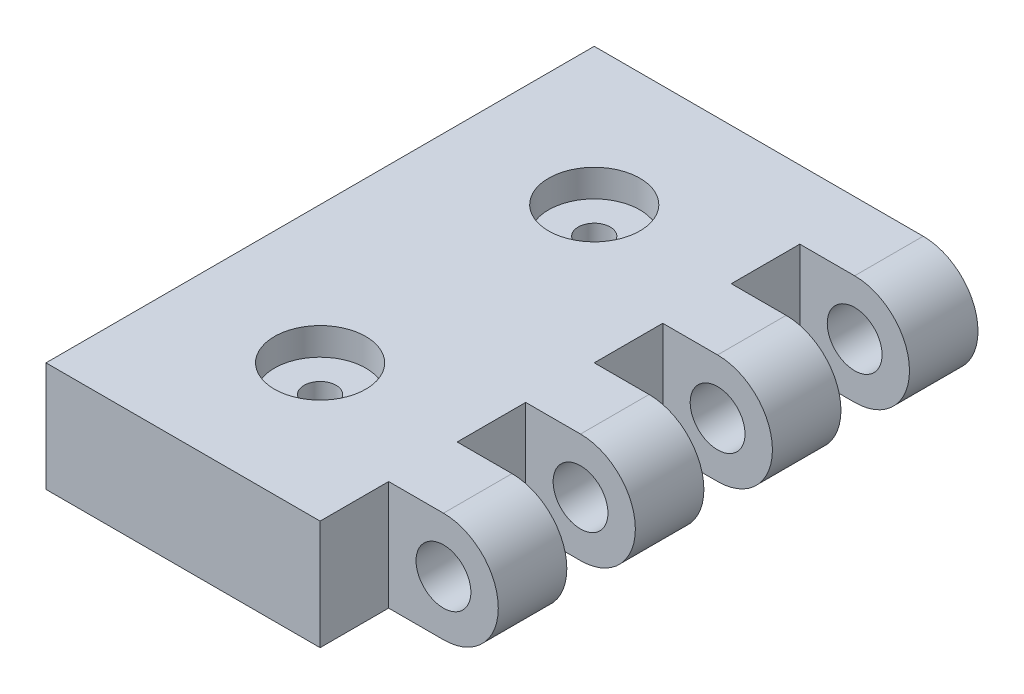
ISO-10303-21;
HEADER;
FILE_DESCRIPTION(('STEP AP214'),'2;1');
FILE_NAME('part.step','',(''),(''),'','','');
FILE_SCHEMA(('AUTOMOTIVE_DESIGN { 1 0 10303 214 1 1 1 1 }'));
ENDSEC;
DATA;
#1=APPLICATION_CONTEXT('core data for automotive mechanical design processes');
#2=APPLICATION_PROTOCOL_DEFINITION('international standard','automotive_design',2000,#1);
#3=PRODUCT_CONTEXT('',#1,'mechanical');
#4=PRODUCT('Part','Part','',(#3));
#5=PRODUCT_RELATED_PRODUCT_CATEGORY('part','',(#4));
#6=PRODUCT_DEFINITION_FORMATION('','',#4);
#7=PRODUCT_DEFINITION_CONTEXT('part definition',#1,'design');
#8=PRODUCT_DEFINITION('design','',#6,#7);
#9=PRODUCT_DEFINITION_SHAPE('','',#8);
#10=(LENGTH_UNIT() NAMED_UNIT(*) SI_UNIT(.MILLI.,.METRE.));
#11=(NAMED_UNIT(*) PLANE_ANGLE_UNIT() SI_UNIT($,.RADIAN.));
#12=(NAMED_UNIT(*) SI_UNIT($,.STERADIAN.) SOLID_ANGLE_UNIT());
#13=UNCERTAINTY_MEASURE_WITH_UNIT(LENGTH_MEASURE(1.E-05),#10,'distance_accuracy_value','');
#14=(GEOMETRIC_REPRESENTATION_CONTEXT(3) GLOBAL_UNCERTAINTY_ASSIGNED_CONTEXT((#13)) GLOBAL_UNIT_ASSIGNED_CONTEXT((#10,
#11,#12)) REPRESENTATION_CONTEXT('',''));
#15=CARTESIAN_POINT('',(0.,0.,0.));
#16=DIRECTION('',(0.,0.,1.));
#17=DIRECTION('',(1.,0.,0.));
#18=AXIS2_PLACEMENT_3D('',#15,#16,#17);
#19=CARTESIAN_POINT('',(-15.,0.,-15.));
#20=DIRECTION('',(0.,1.,0.));
#21=DIRECTION('',(0.,0.,1.));
#22=AXIS2_PLACEMENT_3D('',#19,#20,#21);
#23=CYLINDRICAL_SURFACE('',#22,1.75);
#24=CARTESIAN_POINT('',(-15.,3.,-15.));
#25=DIRECTION('',(0.,1.,0.));
#26=DIRECTION('',(0.,0.,1.));
#27=AXIS2_PLACEMENT_3D('',#24,#25,#26);
#28=CIRCLE('',#27,1.75);
#29=CARTESIAN_POINT('',(-15.,3.,-13.25));
#30=VERTEX_POINT('',#29);
#31=EDGE_CURVE('E48',#30,#30,#28,.F.);
#32=ORIENTED_EDGE('',*,*,#31,.T.);
#33=EDGE_LOOP('',(#32));
#34=FACE_BOUND('',#33,.T.);
#35=CARTESIAN_POINT('',(-15.,9.,-15.));
#36=DIRECTION('',(0.,1.,0.));
#37=DIRECTION('',(0.,0.,1.));
#38=AXIS2_PLACEMENT_3D('',#35,#36,#37);
#39=CIRCLE('',#38,1.75);
#40=CARTESIAN_POINT('',(-15.,9.,-13.25));
#41=VERTEX_POINT('',#40);
#42=EDGE_CURVE('E241',#41,#41,#39,.F.);
#43=ORIENTED_EDGE('',*,*,#42,.F.);
#44=EDGE_LOOP('',(#43));
#45=FACE_BOUND('',#44,.T.);
#46=ADVANCED_FACE('F44',(#34,#45),#23,.F.);
#47=CARTESIAN_POINT('',(-15.,0.,-45.));
#48=DIRECTION('',(0.,1.,0.));
#49=DIRECTION('',(0.,0.,1.));
#50=AXIS2_PLACEMENT_3D('',#47,#48,#49);
#51=CYLINDRICAL_SURFACE('',#50,1.75);
#52=CARTESIAN_POINT('',(-15.,3.,-45.));
#53=DIRECTION('',(0.,1.,0.));
#54=DIRECTION('',(0.,0.,1.));
#55=AXIS2_PLACEMENT_3D('',#52,#53,#54);
#56=CIRCLE('',#55,1.75);
#57=CARTESIAN_POINT('',(-15.,3.,-43.25));
#58=VERTEX_POINT('',#57);
#59=EDGE_CURVE('E338',#58,#58,#56,.F.);
#60=ORIENTED_EDGE('',*,*,#59,.T.);
#61=EDGE_LOOP('',(#60));
#62=FACE_BOUND('',#61,.T.);
#63=CARTESIAN_POINT('',(-15.,9.,-45.));
#64=DIRECTION('',(0.,1.,0.));
#65=DIRECTION('',(0.,0.,1.));
#66=AXIS2_PLACEMENT_3D('',#63,#64,#65);
#67=CIRCLE('',#66,1.75);
#68=CARTESIAN_POINT('',(-15.,9.,-43.25));
#69=VERTEX_POINT('',#68);
#70=EDGE_CURVE('E333',#69,#69,#67,.F.);
#71=ORIENTED_EDGE('',*,*,#70,.F.);
#72=EDGE_LOOP('',(#71));
#73=FACE_BOUND('',#72,.T.);
#74=ADVANCED_FACE('F387',(#62,#73),#51,.F.);
#75=CARTESIAN_POINT('',(6.,6.,-76.9705627484771));
#76=DIRECTION('',(0.,0.,1.));
#77=DIRECTION('',(1.,0.,0.));
#78=AXIS2_PLACEMENT_3D('',#75,#76,#77);
#79=CYLINDRICAL_SURFACE('',#78,6.);
#80=CARTESIAN_POINT('',(6.,6.,-37.5));
#81=DIRECTION('',(0.,0.,-1.));
#82=DIRECTION('',(-1.,0.,0.));
#83=AXIS2_PLACEMENT_3D('',#80,#81,#82);
#84=CIRCLE('',#83,6.);
#85=CARTESIAN_POINT('',(6.,0.,-37.5));
#86=VERTEX_POINT('',#85);
#87=CARTESIAN_POINT('',(6.,12.,-37.5));
#88=VERTEX_POINT('',#87);
#89=EDGE_CURVE('E257',#86,#88,#84,.F.);
#90=ORIENTED_EDGE('',*,*,#89,.F.);
#91=DIRECTION('',(0.,0.,1.));
#92=VECTOR('',#91,1.);
#93=CARTESIAN_POINT('',(6.,0.,-76.9705627484771));
#94=LINE('',#93,#92);
#95=CARTESIAN_POINT('',(6.,0.,-45.));
#96=VERTEX_POINT('',#95);
#97=EDGE_CURVE('E295',#96,#86,#94,.T.);
#98=ORIENTED_EDGE('',*,*,#97,.F.);
#99=CARTESIAN_POINT('',(6.,6.,-45.));
#100=DIRECTION('',(0.,0.,1.));
#101=DIRECTION('',(1.,0.,0.));
#102=AXIS2_PLACEMENT_3D('',#99,#100,#101);
#103=CIRCLE('',#102,6.);
#104=CARTESIAN_POINT('',(6.,12.,-45.));
#105=VERTEX_POINT('',#104);
#106=EDGE_CURVE('E282',#105,#96,#103,.F.);
#107=ORIENTED_EDGE('',*,*,#106,.F.);
#108=DIRECTION('',(0.,0.,1.));
#109=VECTOR('',#108,1.);
#110=CARTESIAN_POINT('',(6.,12.,-76.9705627484771));
#111=LINE('',#110,#109);
#112=EDGE_CURVE('E300',#105,#88,#111,.T.);
#113=ORIENTED_EDGE('',*,*,#112,.T.);
#114=EDGE_LOOP('',(#90,#98,#107,#113));
#115=FACE_BOUND('',#114,.T.);
#116=ADVANCED_FACE('F393',(#115),#79,.T.);
#117=CARTESIAN_POINT('',(6.,6.,-30.));
#118=DIRECTION('',(0.,0.,1.));
#119=DIRECTION('',(1.,0.,0.));
#120=AXIS2_PLACEMENT_3D('',#117,#118,#119);
#121=CIRCLE('',#120,6.);
#122=CARTESIAN_POINT('',(6.,12.,-30.));
#123=VERTEX_POINT('',#122);
#124=CARTESIAN_POINT('',(6.,0.,-30.));
#125=VERTEX_POINT('',#124);
#126=EDGE_CURVE('E69',#123,#125,#121,.F.);
#127=ORIENTED_EDGE('',*,*,#126,.F.);
#128=CARTESIAN_POINT('',(6.,12.,-22.5));
#129=VERTEX_POINT('',#128);
#130=EDGE_CURVE('E501',#123,#129,#111,.T.);
#131=ORIENTED_EDGE('',*,*,#130,.T.);
#132=CARTESIAN_POINT('',(6.,6.,-22.5));
#133=DIRECTION('',(0.,0.,-1.));
#134=DIRECTION('',(-1.,0.,0.));
#135=AXIS2_PLACEMENT_3D('',#132,#133,#134);
#136=CIRCLE('',#135,6.);
#137=CARTESIAN_POINT('',(6.,0.,-22.5));
#138=VERTEX_POINT('',#137);
#139=EDGE_CURVE('E252',#138,#129,#136,.F.);
#140=ORIENTED_EDGE('',*,*,#139,.F.);
#141=EDGE_CURVE('E494',#125,#138,#94,.T.);
#142=ORIENTED_EDGE('',*,*,#141,.F.);
#143=EDGE_LOOP('',(#127,#131,#140,#142));
#144=FACE_BOUND('',#143,.T.);
#145=ADVANCED_FACE('F509',(#144),#79,.T.);
#146=CARTESIAN_POINT('',(6.,6.,-76.9705627484771));
#147=DIRECTION('',(0.,0.,1.));
#148=DIRECTION('',(1.,0.,0.));
#149=AXIS2_PLACEMENT_3D('',#146,#147,#148);
#150=CYLINDRICAL_SURFACE('',#149,3.);
#151=CARTESIAN_POINT('',(6.,6.,-37.5));
#152=DIRECTION('',(0.,0.,-1.));
#153=DIRECTION('',(-1.,0.,0.));
#154=AXIS2_PLACEMENT_3D('',#151,#152,#153);
#155=CIRCLE('',#154,3.);
#156=CARTESIAN_POINT('',(3.,6.,-37.5));
#157=VERTEX_POINT('',#156);
#158=EDGE_CURVE('E256',#157,#157,#155,.F.);
#159=ORIENTED_EDGE('',*,*,#158,.T.);
#160=EDGE_LOOP('',(#159));
#161=FACE_BOUND('',#160,.T.);
#162=CARTESIAN_POINT('',(6.,6.,-45.));
#163=DIRECTION('',(0.,0.,1.));
#164=DIRECTION('',(1.,0.,0.));
#165=AXIS2_PLACEMENT_3D('',#162,#163,#164);
#166=CIRCLE('',#165,3.);
#167=CARTESIAN_POINT('',(9.,6.,-45.));
#168=VERTEX_POINT('',#167);
#169=EDGE_CURVE('E280',#168,#168,#166,.F.);
#170=ORIENTED_EDGE('',*,*,#169,.T.);
#171=EDGE_LOOP('',(#170));
#172=FACE_BOUND('',#171,.T.);
#173=ADVANCED_FACE('F444',(#161,#172),#150,.F.);
#174=CARTESIAN_POINT('',(6.,6.,-52.5));
#175=DIRECTION('',(0.,0.,-1.));
#176=DIRECTION('',(-1.,0.,0.));
#177=AXIS2_PLACEMENT_3D('',#174,#175,#176);
#178=CIRCLE('',#177,6.);
#179=CARTESIAN_POINT('',(6.,0.,-52.5));
#180=VERTEX_POINT('',#179);
#181=CARTESIAN_POINT('',(6.,12.,-52.5));
#182=VERTEX_POINT('',#181);
#183=EDGE_CURVE('E285',#180,#182,#178,.F.);
#184=ORIENTED_EDGE('',*,*,#183,.F.);
#185=CARTESIAN_POINT('',(6.,0.,-60.));
#186=VERTEX_POINT('',#185);
#187=EDGE_CURVE('E292',#186,#180,#94,.T.);
#188=ORIENTED_EDGE('',*,*,#187,.F.);
#189=CARTESIAN_POINT('',(6.,6.,-60.));
#190=DIRECTION('',(0.,0.,1.));
#191=DIRECTION('',(1.,0.,0.));
#192=AXIS2_PLACEMENT_3D('',#189,#190,#191);
#193=CIRCLE('',#192,6.);
#194=CARTESIAN_POINT('',(6.,12.,-60.));
#195=VERTEX_POINT('',#194);
#196=EDGE_CURVE('E288',#195,#186,#193,.F.);
#197=ORIENTED_EDGE('',*,*,#196,.F.);
#198=EDGE_CURVE('E297',#195,#182,#111,.T.);
#199=ORIENTED_EDGE('',*,*,#198,.T.);
#200=EDGE_LOOP('',(#184,#188,#197,#199));
#201=FACE_BOUND('',#200,.T.);
#202=ADVANCED_FACE('F448',(#201),#79,.T.);
#203=CARTESIAN_POINT('',(6.,6.,-52.5));
#204=DIRECTION('',(0.,0.,-1.));
#205=DIRECTION('',(-1.,0.,0.));
#206=AXIS2_PLACEMENT_3D('',#203,#204,#205);
#207=CIRCLE('',#206,3.);
#208=CARTESIAN_POINT('',(3.,6.,-52.5));
#209=VERTEX_POINT('',#208);
#210=EDGE_CURVE('E284',#209,#209,#207,.F.);
#211=ORIENTED_EDGE('',*,*,#210,.T.);
#212=EDGE_LOOP('',(#211));
#213=FACE_BOUND('',#212,.T.);
#214=CARTESIAN_POINT('',(6.,6.,-60.));
#215=DIRECTION('',(0.,0.,1.));
#216=DIRECTION('',(1.,0.,0.));
#217=AXIS2_PLACEMENT_3D('',#214,#215,#216);
#218=CIRCLE('',#217,3.);
#219=CARTESIAN_POINT('',(9.,6.,-60.));
#220=VERTEX_POINT('',#219);
#221=EDGE_CURVE('E291',#220,#220,#218,.F.);
#222=ORIENTED_EDGE('',*,*,#221,.T.);
#223=EDGE_LOOP('',(#222));
#224=FACE_BOUND('',#223,.T.);
#225=ADVANCED_FACE('F445',(#213,#224),#150,.F.);
#226=CARTESIAN_POINT('',(0.,12.,-60.));
#227=DIRECTION('',(0.,0.,1.));
#228=DIRECTION('',(1.,0.,0.));
#229=AXIS2_PLACEMENT_3D('',#226,#227,#228);
#230=PLANE('',#229);
#231=DIRECTION('',(-1.,0.,0.));
#232=VECTOR('',#231,1.);
#233=CARTESIAN_POINT('',(0.,0.,-60.));
#234=LINE('',#233,#232);
#235=CARTESIAN_POINT('',(-30.,0.,-60.));
#236=VERTEX_POINT('',#235);
#237=EDGE_CURVE('E303',#186,#236,#234,.T.);
#238=ORIENTED_EDGE('',*,*,#237,.T.);
#239=DIRECTION('',(0.,-1.,0.));
#240=VECTOR('',#239,1.);
#241=CARTESIAN_POINT('',(-30.,12.,-60.));
#242=LINE('',#241,#240);
#243=CARTESIAN_POINT('',(-30.,12.,-60.));
#244=VERTEX_POINT('',#243);
#245=EDGE_CURVE('E11',#244,#236,#242,.T.);
#246=ORIENTED_EDGE('',*,*,#245,.F.);
#247=DIRECTION('',(-1.,0.,0.));
#248=VECTOR('',#247,1.);
#249=CARTESIAN_POINT('',(0.,12.,-60.));
#250=LINE('',#249,#248);
#251=EDGE_CURVE('E304',#195,#244,#250,.T.);
#252=ORIENTED_EDGE('',*,*,#251,.F.);
#253=ORIENTED_EDGE('',*,*,#196,.T.);
#254=EDGE_LOOP('',(#238,#246,#252,#253));
#255=FACE_BOUND('',#254,.T.);
#256=ORIENTED_EDGE('',*,*,#221,.F.);
#257=EDGE_LOOP('',(#256));
#258=FACE_BOUND('',#257,.T.);
#259=ADVANCED_FACE('F46',(#255,#258),#230,.F.);
#260=CARTESIAN_POINT('',(-30.,12.,0.));
#261=DIRECTION('',(1.,0.,0.));
#262=DIRECTION('',(0.,0.,-1.));
#263=AXIS2_PLACEMENT_3D('',#260,#261,#262);
#264=PLANE('',#263);
#265=DIRECTION('',(0.,0.,1.));
#266=VECTOR('',#265,1.);
#267=CARTESIAN_POINT('',(-30.,0.,0.));
#268=LINE('',#267,#266);
#269=CARTESIAN_POINT('',(-30.,0.,0.));
#270=VERTEX_POINT('',#269);
#271=EDGE_CURVE('E313',#236,#270,#268,.T.);
#272=ORIENTED_EDGE('',*,*,#271,.T.);
#273=DIRECTION('',(0.,-1.,0.));
#274=VECTOR('',#273,1.);
#275=CARTESIAN_POINT('',(-30.,12.,0.));
#276=LINE('',#275,#274);
#277=CARTESIAN_POINT('',(-30.,12.,0.));
#278=VERTEX_POINT('',#277);
#279=EDGE_CURVE('E53',#278,#270,#276,.T.);
#280=ORIENTED_EDGE('',*,*,#279,.F.);
#281=DIRECTION('',(0.,0.,1.));
#282=VECTOR('',#281,1.);
#283=CARTESIAN_POINT('',(-30.,12.,0.));
#284=LINE('',#283,#282);
#285=EDGE_CURVE('E306',#244,#278,#284,.T.);
#286=ORIENTED_EDGE('',*,*,#285,.F.);
#287=ORIENTED_EDGE('',*,*,#245,.T.);
#288=EDGE_LOOP('',(#272,#280,#286,#287));
#289=FACE_BOUND('',#288,.T.);
#290=ADVANCED_FACE('F457',(#289),#264,.F.);
#291=CARTESIAN_POINT('',(0.,12.,0.));
#292=DIRECTION('',(0.,0.,-1.));
#293=DIRECTION('',(-1.,0.,0.));
#294=AXIS2_PLACEMENT_3D('',#291,#292,#293);
#295=PLANE('',#294);
#296=DIRECTION('',(1.,0.,0.));
#297=VECTOR('',#296,1.);
#298=CARTESIAN_POINT('',(0.,0.,0.));
#299=LINE('',#298,#297);
#300=CARTESIAN_POINT('',(0.,0.,0.));
#301=VERTEX_POINT('',#300);
#302=EDGE_CURVE('E307',#270,#301,#299,.T.);
#303=ORIENTED_EDGE('',*,*,#302,.T.);
#304=DIRECTION('',(0.,1.,0.));
#305=VECTOR('',#304,1.);
#306=CARTESIAN_POINT('',(0.,0.,0.));
#307=LINE('',#306,#305);
#308=CARTESIAN_POINT('',(0.,12.,0.));
#309=VERTEX_POINT('',#308);
#310=EDGE_CURVE('E238',#301,#309,#307,.T.);
#311=ORIENTED_EDGE('',*,*,#310,.T.);
#312=DIRECTION('',(1.,0.,0.));
#313=VECTOR('',#312,1.);
#314=CARTESIAN_POINT('',(0.,12.,0.));
#315=LINE('',#314,#313);
#316=EDGE_CURVE('E309',#278,#309,#315,.T.);
#317=ORIENTED_EDGE('',*,*,#316,.F.);
#318=ORIENTED_EDGE('',*,*,#279,.T.);
#319=EDGE_LOOP('',(#303,#311,#317,#318));
#320=FACE_BOUND('',#319,.T.);
#321=ADVANCED_FACE('F452',(#320),#295,.F.);
#322=CARTESIAN_POINT('',(0.,12.,0.));
#323=DIRECTION('',(0.,1.,0.));
#324=DIRECTION('',(0.,0.,1.));
#325=AXIS2_PLACEMENT_3D('',#322,#323,#324);
#326=PLANE('',#325);
#327=CARTESIAN_POINT('',(-15.,12.,-45.));
#328=DIRECTION('',(0.,1.,0.));
#329=DIRECTION('',(0.,0.,1.));
#330=AXIS2_PLACEMENT_3D('',#327,#328,#329);
#331=CIRCLE('',#330,5.);
#332=CARTESIAN_POINT('',(-15.,12.,-40.));
#333=VERTEX_POINT('',#332);
#334=EDGE_CURVE('E360',#333,#333,#331,.T.);
#335=ORIENTED_EDGE('',*,*,#334,.F.);
#336=EDGE_LOOP('',(#335));
#337=FACE_BOUND('',#336,.T.);
#338=CARTESIAN_POINT('',(-15.,12.,-15.));
#339=DIRECTION('',(0.,1.,0.));
#340=DIRECTION('',(0.,0.,1.));
#341=AXIS2_PLACEMENT_3D('',#338,#339,#340);
#342=CIRCLE('',#341,5.);
#343=CARTESIAN_POINT('',(-15.,12.,-9.99999999999999));
#344=VERTEX_POINT('',#343);
#345=EDGE_CURVE('E362',#344,#344,#342,.T.);
#346=ORIENTED_EDGE('',*,*,#345,.F.);
#347=EDGE_LOOP('',(#346));
#348=FACE_BOUND('',#347,.T.);
#349=DIRECTION('',(-1.,0.,0.));
#350=VECTOR('',#349,1.);
#351=CARTESIAN_POINT('',(0.,12.,-37.5));
#352=LINE('',#351,#350);
#353=CARTESIAN_POINT('',(0.,12.,-37.5));
#354=VERTEX_POINT('',#353);
#355=EDGE_CURVE('E196',#88,#354,#352,.T.);
#356=ORIENTED_EDGE('',*,*,#355,.F.);
#357=ORIENTED_EDGE('',*,*,#112,.F.);
#358=DIRECTION('',(1.,0.,0.));
#359=VECTOR('',#358,1.);
#360=CARTESIAN_POINT('',(0.,12.,-45.));
#361=LINE('',#360,#359);
#362=CARTESIAN_POINT('',(0.,12.,-45.));
#363=VERTEX_POINT('',#362);
#364=EDGE_CURVE('E273',#363,#105,#361,.T.);
#365=ORIENTED_EDGE('',*,*,#364,.F.);
#366=DIRECTION('',(0.,0.,1.));
#367=VECTOR('',#366,1.);
#368=CARTESIAN_POINT('',(0.,12.,-52.5));
#369=LINE('',#368,#367);
#370=CARTESIAN_POINT('',(0.,12.,-52.5));
#371=VERTEX_POINT('',#370);
#372=EDGE_CURVE('E259',#371,#363,#369,.T.);
#373=ORIENTED_EDGE('',*,*,#372,.F.);
#374=DIRECTION('',(-1.,0.,0.));
#375=VECTOR('',#374,1.);
#376=CARTESIAN_POINT('',(0.,12.,-52.5));
#377=LINE('',#376,#375);
#378=EDGE_CURVE('E264',#182,#371,#377,.T.);
#379=ORIENTED_EDGE('',*,*,#378,.F.);
#380=ORIENTED_EDGE('',*,*,#198,.F.);
#381=ORIENTED_EDGE('',*,*,#251,.T.);
#382=ORIENTED_EDGE('',*,*,#285,.T.);
#383=ORIENTED_EDGE('',*,*,#316,.T.);
#384=DIRECTION('',(0.,0.,1.));
#385=VECTOR('',#384,1.);
#386=CARTESIAN_POINT('',(0.,12.,-7.5));
#387=LINE('',#386,#385);
#388=CARTESIAN_POINT('',(0.,12.,-7.5));
#389=VERTEX_POINT('',#388);
#390=EDGE_CURVE('E239',#389,#309,#387,.T.);
#391=ORIENTED_EDGE('',*,*,#390,.F.);
#392=DIRECTION('',(-1.,0.,0.));
#393=VECTOR('',#392,1.);
#394=CARTESIAN_POINT('',(0.,12.,-7.5));
#395=LINE('',#394,#393);
#396=CARTESIAN_POINT('',(6.,12.,-7.5));
#397=VERTEX_POINT('',#396);
#398=EDGE_CURVE('E235',#397,#389,#395,.T.);
#399=ORIENTED_EDGE('',*,*,#398,.F.);
#400=CARTESIAN_POINT('',(6.,12.,-15.));
#401=VERTEX_POINT('',#400);
#402=EDGE_CURVE('E287',#401,#397,#111,.T.);
#403=ORIENTED_EDGE('',*,*,#402,.F.);
#404=DIRECTION('',(1.,0.,0.));
#405=VECTOR('',#404,1.);
#406=CARTESIAN_POINT('',(0.,12.,-15.));
#407=LINE('',#406,#405);
#408=CARTESIAN_POINT('',(0.,12.,-15.));
#409=VERTEX_POINT('',#408);
#410=EDGE_CURVE('E224',#409,#401,#407,.T.);
#411=ORIENTED_EDGE('',*,*,#410,.F.);
#412=DIRECTION('',(0.,0.,1.));
#413=VECTOR('',#412,1.);
#414=CARTESIAN_POINT('',(0.,12.,-22.5));
#415=LINE('',#414,#413);
#416=CARTESIAN_POINT('',(0.,12.,-22.5));
#417=VERTEX_POINT('',#416);
#418=EDGE_CURVE('E221',#417,#409,#415,.T.);
#419=ORIENTED_EDGE('',*,*,#418,.F.);
#420=DIRECTION('',(-1.,0.,0.));
#421=VECTOR('',#420,1.);
#422=CARTESIAN_POINT('',(0.,12.,-22.5));
#423=LINE('',#422,#421);
#424=EDGE_CURVE('E214',#129,#417,#423,.T.);
#425=ORIENTED_EDGE('',*,*,#424,.F.);
#426=ORIENTED_EDGE('',*,*,#130,.F.);
#427=DIRECTION('',(1.,0.,0.));
#428=VECTOR('',#427,1.);
#429=CARTESIAN_POINT('',(0.,12.,-30.));
#430=LINE('',#429,#428);
#431=CARTESIAN_POINT('',(0.,12.,-30.));
#432=VERTEX_POINT('',#431);
#433=EDGE_CURVE('E198',#432,#123,#430,.T.);
#434=ORIENTED_EDGE('',*,*,#433,.F.);
#435=DIRECTION('',(0.,0.,1.));
#436=VECTOR('',#435,1.);
#437=CARTESIAN_POINT('',(0.,12.,-37.5));
#438=LINE('',#437,#436);
#439=EDGE_CURVE('E181',#354,#432,#438,.T.);
#440=ORIENTED_EDGE('',*,*,#439,.F.);
#441=EDGE_LOOP('',(#356,#357,#365,#373,#379,#380,#381,#382,#383,#391,#399,#403,#411,#419,#425,
#426,#434,#440));
#442=FACE_BOUND('',#441,.T.);
#443=ADVANCED_FACE('F449',(#337,#348,#442),#326,.T.);
#444=CARTESIAN_POINT('',(0.,0.,0.));
#445=DIRECTION('',(0.,1.,0.));
#446=DIRECTION('',(0.,0.,1.));
#447=AXIS2_PLACEMENT_3D('',#444,#445,#446);
#448=PLANE('',#447);
#449=CARTESIAN_POINT('',(-15.,0.,-45.));
#450=DIRECTION('',(0.,1.,0.));
#451=DIRECTION('',(0.,0.,1.));
#452=AXIS2_PLACEMENT_3D('',#449,#450,#451);
#453=CIRCLE('',#452,5.);
#454=CARTESIAN_POINT('',(-15.,0.,-40.));
#455=VERTEX_POINT('',#454);
#456=EDGE_CURVE('E340',#455,#455,#453,.T.);
#457=ORIENTED_EDGE('',*,*,#456,.T.);
#458=EDGE_LOOP('',(#457));
#459=FACE_BOUND('',#458,.T.);
#460=CARTESIAN_POINT('',(-15.,0.,-15.));
#461=DIRECTION('',(0.,1.,0.));
#462=DIRECTION('',(0.,0.,1.));
#463=AXIS2_PLACEMENT_3D('',#460,#461,#462);
#464=CIRCLE('',#463,5.);
#465=CARTESIAN_POINT('',(-15.,0.,-9.99999999999999));
#466=VERTEX_POINT('',#465);
#467=EDGE_CURVE('E350',#466,#466,#464,.T.);
#468=ORIENTED_EDGE('',*,*,#467,.T.);
#469=EDGE_LOOP('',(#468));
#470=FACE_BOUND('',#469,.T.);
#471=ORIENTED_EDGE('',*,*,#97,.T.);
#472=DIRECTION('',(-1.,0.,0.));
#473=VECTOR('',#472,1.);
#474=CARTESIAN_POINT('',(0.,0.,-37.5));
#475=LINE('',#474,#473);
#476=CARTESIAN_POINT('',(0.,0.,-37.5));
#477=VERTEX_POINT('',#476);
#478=EDGE_CURVE('E185',#86,#477,#475,.T.);
#479=ORIENTED_EDGE('',*,*,#478,.T.);
#480=DIRECTION('',(0.,0.,1.));
#481=VECTOR('',#480,1.);
#482=CARTESIAN_POINT('',(0.,0.,-37.5));
#483=LINE('',#482,#481);
#484=CARTESIAN_POINT('',(0.,0.,-30.));
#485=VERTEX_POINT('',#484);
#486=EDGE_CURVE('E178',#477,#485,#483,.T.);
#487=ORIENTED_EDGE('',*,*,#486,.T.);
#488=DIRECTION('',(1.,0.,0.));
#489=VECTOR('',#488,1.);
#490=CARTESIAN_POINT('',(0.,0.,-30.));
#491=LINE('',#490,#489);
#492=EDGE_CURVE('E188',#485,#125,#491,.T.);
#493=ORIENTED_EDGE('',*,*,#492,.T.);
#494=ORIENTED_EDGE('',*,*,#141,.T.);
#495=DIRECTION('',(-1.,0.,0.));
#496=VECTOR('',#495,1.);
#497=CARTESIAN_POINT('',(0.,0.,-22.5));
#498=LINE('',#497,#496);
#499=CARTESIAN_POINT('',(0.,0.,-22.5));
#500=VERTEX_POINT('',#499);
#501=EDGE_CURVE('E217',#138,#500,#498,.T.);
#502=ORIENTED_EDGE('',*,*,#501,.T.);
#503=DIRECTION('',(0.,0.,1.));
#504=VECTOR('',#503,1.);
#505=CARTESIAN_POINT('',(0.,0.,-22.5));
#506=LINE('',#505,#504);
#507=CARTESIAN_POINT('',(0.,0.,-15.));
#508=VERTEX_POINT('',#507);
#509=EDGE_CURVE('E210',#500,#508,#506,.T.);
#510=ORIENTED_EDGE('',*,*,#509,.T.);
#511=DIRECTION('',(1.,0.,0.));
#512=VECTOR('',#511,1.);
#513=CARTESIAN_POINT('',(0.,0.,-15.));
#514=LINE('',#513,#512);
#515=CARTESIAN_POINT('',(6.,0.,-15.));
#516=VERTEX_POINT('',#515);
#517=EDGE_CURVE('E213',#508,#516,#514,.T.);
#518=ORIENTED_EDGE('',*,*,#517,.T.);
#519=CARTESIAN_POINT('',(6.,0.,-7.5));
#520=VERTEX_POINT('',#519);
#521=EDGE_CURVE('E296',#516,#520,#94,.T.);
#522=ORIENTED_EDGE('',*,*,#521,.T.);
#523=DIRECTION('',(-1.,0.,0.));
#524=VECTOR('',#523,1.);
#525=CARTESIAN_POINT('',(0.,0.,-7.5));
#526=LINE('',#525,#524);
#527=CARTESIAN_POINT('',(0.,0.,-7.5));
#528=VERTEX_POINT('',#527);
#529=EDGE_CURVE('E234',#520,#528,#526,.T.);
#530=ORIENTED_EDGE('',*,*,#529,.T.);
#531=DIRECTION('',(0.,0.,1.));
#532=VECTOR('',#531,1.);
#533=CARTESIAN_POINT('',(0.,0.,-7.5));
#534=LINE('',#533,#532);
#535=EDGE_CURVE('E231',#528,#301,#534,.T.);
#536=ORIENTED_EDGE('',*,*,#535,.T.);
#537=ORIENTED_EDGE('',*,*,#302,.F.);
#538=ORIENTED_EDGE('',*,*,#271,.F.);
#539=ORIENTED_EDGE('',*,*,#237,.F.);
#540=ORIENTED_EDGE('',*,*,#187,.T.);
#541=DIRECTION('',(-1.,0.,0.));
#542=VECTOR('',#541,1.);
#543=CARTESIAN_POINT('',(0.,0.,-52.5));
#544=LINE('',#543,#542);
#545=CARTESIAN_POINT('',(0.,0.,-52.5));
#546=VERTEX_POINT('',#545);
#547=EDGE_CURVE('E267',#180,#546,#544,.T.);
#548=ORIENTED_EDGE('',*,*,#547,.T.);
#549=DIRECTION('',(0.,0.,1.));
#550=VECTOR('',#549,1.);
#551=CARTESIAN_POINT('',(0.,0.,-52.5));
#552=LINE('',#551,#550);
#553=CARTESIAN_POINT('',(0.,0.,-45.));
#554=VERTEX_POINT('',#553);
#555=EDGE_CURVE('E260',#546,#554,#552,.T.);
#556=ORIENTED_EDGE('',*,*,#555,.T.);
#557=DIRECTION('',(1.,0.,0.));
#558=VECTOR('',#557,1.);
#559=CARTESIAN_POINT('',(0.,0.,-45.));
#560=LINE('',#559,#558);
#561=EDGE_CURVE('E263',#554,#96,#560,.T.);
#562=ORIENTED_EDGE('',*,*,#561,.T.);
#563=EDGE_LOOP('',(#471,#479,#487,#493,#494,#502,#510,#518,#522,#530,#536,#537,#538,#539,#540,
#548,#556,#562));
#564=FACE_BOUND('',#563,.T.);
#565=ADVANCED_FACE('F195',(#459,#470,#564),#448,.F.);
#566=CARTESIAN_POINT('',(6.,6.,-15.));
#567=DIRECTION('',(0.,0.,1.));
#568=DIRECTION('',(1.,0.,0.));
#569=AXIS2_PLACEMENT_3D('',#566,#567,#568);
#570=CIRCLE('',#569,6.);
#571=EDGE_CURVE('E61',#401,#516,#570,.F.);
#572=ORIENTED_EDGE('',*,*,#571,.F.);
#573=ORIENTED_EDGE('',*,*,#402,.T.);
#574=CARTESIAN_POINT('',(6.,6.,-7.50000000000001));
#575=DIRECTION('',(0.,0.,-1.));
#576=DIRECTION('',(-1.,0.,0.));
#577=AXIS2_PLACEMENT_3D('',#574,#575,#576);
#578=CIRCLE('',#577,6.);
#579=EDGE_CURVE('E247',#520,#397,#578,.F.);
#580=ORIENTED_EDGE('',*,*,#579,.F.);
#581=ORIENTED_EDGE('',*,*,#521,.F.);
#582=EDGE_LOOP('',(#572,#573,#580,#581));
#583=FACE_BOUND('',#582,.T.);
#584=ADVANCED_FACE('F432',(#583),#79,.T.);
#585=CARTESIAN_POINT('',(0.,0.,-52.5));
#586=DIRECTION('',(0.,0.,-1.));
#587=DIRECTION('',(-1.,0.,0.));
#588=AXIS2_PLACEMENT_3D('',#585,#586,#587);
#589=PLANE('',#588);
#590=ORIENTED_EDGE('',*,*,#183,.T.);
#591=ORIENTED_EDGE('',*,*,#378,.T.);
#592=DIRECTION('',(0.,1.,0.));
#593=VECTOR('',#592,1.);
#594=CARTESIAN_POINT('',(0.,0.,-52.5));
#595=LINE('',#594,#593);
#596=EDGE_CURVE('E277',#546,#371,#595,.T.);
#597=ORIENTED_EDGE('',*,*,#596,.F.);
#598=ORIENTED_EDGE('',*,*,#547,.F.);
#599=EDGE_LOOP('',(#590,#591,#597,#598));
#600=FACE_BOUND('',#599,.T.);
#601=ORIENTED_EDGE('',*,*,#210,.F.);
#602=EDGE_LOOP('',(#601));
#603=FACE_BOUND('',#602,.T.);
#604=ADVANCED_FACE('F428',(#600,#603),#589,.F.);
#605=CARTESIAN_POINT('',(0.,0.,-45.));
#606=DIRECTION('',(0.,0.,1.));
#607=DIRECTION('',(1.,0.,0.));
#608=AXIS2_PLACEMENT_3D('',#605,#606,#607);
#609=PLANE('',#608);
#610=ORIENTED_EDGE('',*,*,#106,.T.);
#611=ORIENTED_EDGE('',*,*,#561,.F.);
#612=DIRECTION('',(0.,1.,0.));
#613=VECTOR('',#612,1.);
#614=CARTESIAN_POINT('',(0.,0.,-45.));
#615=LINE('',#614,#613);
#616=EDGE_CURVE('E270',#554,#363,#615,.T.);
#617=ORIENTED_EDGE('',*,*,#616,.T.);
#618=ORIENTED_EDGE('',*,*,#364,.T.);
#619=EDGE_LOOP('',(#610,#611,#617,#618));
#620=FACE_BOUND('',#619,.T.);
#621=ORIENTED_EDGE('',*,*,#169,.F.);
#622=EDGE_LOOP('',(#621));
#623=FACE_BOUND('',#622,.T.);
#624=ADVANCED_FACE('F431',(#620,#623),#609,.F.);
#625=CARTESIAN_POINT('',(0.,0.,-52.5));
#626=DIRECTION('',(-1.,0.,0.));
#627=DIRECTION('',(0.,0.,1.));
#628=AXIS2_PLACEMENT_3D('',#625,#626,#627);
#629=PLANE('',#628);
#630=ORIENTED_EDGE('',*,*,#372,.T.);
#631=ORIENTED_EDGE('',*,*,#616,.F.);
#632=ORIENTED_EDGE('',*,*,#555,.F.);
#633=ORIENTED_EDGE('',*,*,#596,.T.);
#634=EDGE_LOOP('',(#630,#631,#632,#633));
#635=FACE_BOUND('',#634,.T.);
#636=ADVANCED_FACE('F423',(#635),#629,.F.);
#637=CARTESIAN_POINT('',(0.,0.,-7.5));
#638=DIRECTION('',(0.,0.,-1.));
#639=DIRECTION('',(-1.,0.,0.));
#640=AXIS2_PLACEMENT_3D('',#637,#638,#639);
#641=PLANE('',#640);
#642=ORIENTED_EDGE('',*,*,#579,.T.);
#643=ORIENTED_EDGE('',*,*,#398,.T.);
#644=DIRECTION('',(0.,1.,0.));
#645=VECTOR('',#644,1.);
#646=CARTESIAN_POINT('',(0.,0.,-7.5));
#647=LINE('',#646,#645);
#648=EDGE_CURVE('E225',#528,#389,#647,.T.);
#649=ORIENTED_EDGE('',*,*,#648,.F.);
#650=ORIENTED_EDGE('',*,*,#529,.F.);
#651=EDGE_LOOP('',(#642,#643,#649,#650));
#652=FACE_BOUND('',#651,.T.);
#653=CARTESIAN_POINT('',(6.,6.,-7.50000000000001));
#654=DIRECTION('',(0.,0.,-1.));
#655=DIRECTION('',(-1.,0.,0.));
#656=AXIS2_PLACEMENT_3D('',#653,#654,#655);
#657=CIRCLE('',#656,3.);
#658=CARTESIAN_POINT('',(3.,6.,-7.50000000000001));
#659=VERTEX_POINT('',#658);
#660=EDGE_CURVE('E208',#659,#659,#657,.F.);
#661=ORIENTED_EDGE('',*,*,#660,.F.);
#662=EDGE_LOOP('',(#661));
#663=FACE_BOUND('',#662,.T.);
#664=ADVANCED_FACE('F420',(#652,#663),#641,.F.);
#665=CARTESIAN_POINT('',(0.,0.,-7.5));
#666=DIRECTION('',(-1.,0.,0.));
#667=DIRECTION('',(0.,0.,1.));
#668=AXIS2_PLACEMENT_3D('',#665,#666,#667);
#669=PLANE('',#668);
#670=ORIENTED_EDGE('',*,*,#390,.T.);
#671=ORIENTED_EDGE('',*,*,#310,.F.);
#672=ORIENTED_EDGE('',*,*,#535,.F.);
#673=ORIENTED_EDGE('',*,*,#648,.T.);
#674=EDGE_LOOP('',(#670,#671,#672,#673));
#675=FACE_BOUND('',#674,.T.);
#676=ADVANCED_FACE('F411',(#675),#669,.F.);
#677=CARTESIAN_POINT('',(0.,0.,-22.5));
#678=DIRECTION('',(0.,0.,-1.));
#679=DIRECTION('',(-1.,0.,0.));
#680=AXIS2_PLACEMENT_3D('',#677,#678,#679);
#681=PLANE('',#680);
#682=ORIENTED_EDGE('',*,*,#139,.T.);
#683=ORIENTED_EDGE('',*,*,#424,.T.);
#684=DIRECTION('',(0.,1.,0.));
#685=VECTOR('',#684,1.);
#686=CARTESIAN_POINT('',(0.,0.,-22.5));
#687=LINE('',#686,#685);
#688=EDGE_CURVE('E206',#500,#417,#687,.T.);
#689=ORIENTED_EDGE('',*,*,#688,.F.);
#690=ORIENTED_EDGE('',*,*,#501,.F.);
#691=EDGE_LOOP('',(#682,#683,#689,#690));
#692=FACE_BOUND('',#691,.T.);
#693=CARTESIAN_POINT('',(6.,6.,-22.5));
#694=DIRECTION('',(0.,0.,-1.));
#695=DIRECTION('',(-1.,0.,0.));
#696=AXIS2_PLACEMENT_3D('',#693,#694,#695);
#697=CIRCLE('',#696,3.);
#698=CARTESIAN_POINT('',(3.,6.,-22.5));
#699=VERTEX_POINT('',#698);
#700=EDGE_CURVE('E251',#699,#699,#697,.F.);
#701=ORIENTED_EDGE('',*,*,#700,.F.);
#702=EDGE_LOOP('',(#701));
#703=FACE_BOUND('',#702,.T.);
#704=ADVANCED_FACE('F407',(#692,#703),#681,.F.);
#705=CARTESIAN_POINT('',(0.,0.,-15.));
#706=DIRECTION('',(0.,0.,1.));
#707=DIRECTION('',(1.,0.,0.));
#708=AXIS2_PLACEMENT_3D('',#705,#706,#707);
#709=PLANE('',#708);
#710=ORIENTED_EDGE('',*,*,#571,.T.);
#711=ORIENTED_EDGE('',*,*,#517,.F.);
#712=DIRECTION('',(0.,1.,0.));
#713=VECTOR('',#712,1.);
#714=CARTESIAN_POINT('',(0.,0.,-15.));
#715=LINE('',#714,#713);
#716=EDGE_CURVE('E220',#508,#409,#715,.T.);
#717=ORIENTED_EDGE('',*,*,#716,.T.);
#718=ORIENTED_EDGE('',*,*,#410,.T.);
#719=EDGE_LOOP('',(#710,#711,#717,#718));
#720=FACE_BOUND('',#719,.T.);
#721=CARTESIAN_POINT('',(6.,6.,-15.));
#722=DIRECTION('',(0.,0.,1.));
#723=DIRECTION('',(1.,0.,0.));
#724=AXIS2_PLACEMENT_3D('',#721,#722,#723);
#725=CIRCLE('',#724,3.);
#726=CARTESIAN_POINT('',(9.,6.,-15.));
#727=VERTEX_POINT('',#726);
#728=EDGE_CURVE('E249',#727,#727,#725,.F.);
#729=ORIENTED_EDGE('',*,*,#728,.F.);
#730=EDGE_LOOP('',(#729));
#731=FACE_BOUND('',#730,.T.);
#732=ADVANCED_FACE('F410',(#720,#731),#709,.F.);
#733=CARTESIAN_POINT('',(0.,0.,-22.5));
#734=DIRECTION('',(-1.,0.,0.));
#735=DIRECTION('',(0.,0.,1.));
#736=AXIS2_PLACEMENT_3D('',#733,#734,#735);
#737=PLANE('',#736);
#738=ORIENTED_EDGE('',*,*,#418,.T.);
#739=ORIENTED_EDGE('',*,*,#716,.F.);
#740=ORIENTED_EDGE('',*,*,#509,.F.);
#741=ORIENTED_EDGE('',*,*,#688,.T.);
#742=EDGE_LOOP('',(#738,#739,#740,#741));
#743=FACE_BOUND('',#742,.T.);
#744=ADVANCED_FACE('F415',(#743),#737,.F.);
#745=CARTESIAN_POINT('',(6.,6.,-30.));
#746=DIRECTION('',(0.,0.,1.));
#747=DIRECTION('',(1.,0.,0.));
#748=AXIS2_PLACEMENT_3D('',#745,#746,#747);
#749=CIRCLE('',#748,3.);
#750=CARTESIAN_POINT('',(9.,6.,-30.));
#751=VERTEX_POINT('',#750);
#752=EDGE_CURVE('E254',#751,#751,#749,.F.);
#753=ORIENTED_EDGE('',*,*,#752,.T.);
#754=EDGE_LOOP('',(#753));
#755=FACE_BOUND('',#754,.T.);
#756=ORIENTED_EDGE('',*,*,#700,.T.);
#757=EDGE_LOOP('',(#756));
#758=FACE_BOUND('',#757,.T.);
#759=ADVANCED_FACE('F400',(#755,#758),#150,.F.);
#760=CARTESIAN_POINT('',(0.,0.,-37.5));
#761=DIRECTION('',(0.,0.,-1.));
#762=DIRECTION('',(-1.,0.,0.));
#763=AXIS2_PLACEMENT_3D('',#760,#761,#762);
#764=PLANE('',#763);
#765=ORIENTED_EDGE('',*,*,#89,.T.);
#766=ORIENTED_EDGE('',*,*,#355,.T.);
#767=DIRECTION('',(0.,1.,0.));
#768=VECTOR('',#767,1.);
#769=CARTESIAN_POINT('',(0.,0.,-37.5));
#770=LINE('',#769,#768);
#771=EDGE_CURVE('E184',#477,#354,#770,.T.);
#772=ORIENTED_EDGE('',*,*,#771,.F.);
#773=ORIENTED_EDGE('',*,*,#478,.F.);
#774=EDGE_LOOP('',(#765,#766,#772,#773));
#775=FACE_BOUND('',#774,.T.);
#776=ORIENTED_EDGE('',*,*,#158,.F.);
#777=EDGE_LOOP('',(#776));
#778=FACE_BOUND('',#777,.T.);
#779=ADVANCED_FACE('F397',(#775,#778),#764,.F.);
#780=CARTESIAN_POINT('',(0.,0.,-30.));
#781=DIRECTION('',(0.,0.,1.));
#782=DIRECTION('',(1.,0.,0.));
#783=AXIS2_PLACEMENT_3D('',#780,#781,#782);
#784=PLANE('',#783);
#785=ORIENTED_EDGE('',*,*,#126,.T.);
#786=ORIENTED_EDGE('',*,*,#492,.F.);
#787=DIRECTION('',(0.,1.,0.));
#788=VECTOR('',#787,1.);
#789=CARTESIAN_POINT('',(0.,0.,-30.));
#790=LINE('',#789,#788);
#791=EDGE_CURVE('E173',#485,#432,#790,.T.);
#792=ORIENTED_EDGE('',*,*,#791,.T.);
#793=ORIENTED_EDGE('',*,*,#433,.T.);
#794=EDGE_LOOP('',(#785,#786,#792,#793));
#795=FACE_BOUND('',#794,.T.);
#796=ORIENTED_EDGE('',*,*,#752,.F.);
#797=EDGE_LOOP('',(#796));
#798=FACE_BOUND('',#797,.T.);
#799=ADVANCED_FACE('F189',(#795,#798),#784,.F.);
#800=CARTESIAN_POINT('',(0.,0.,-37.5));
#801=DIRECTION('',(-1.,0.,0.));
#802=DIRECTION('',(0.,0.,1.));
#803=AXIS2_PLACEMENT_3D('',#800,#801,#802);
#804=PLANE('',#803);
#805=ORIENTED_EDGE('',*,*,#439,.T.);
#806=ORIENTED_EDGE('',*,*,#791,.F.);
#807=ORIENTED_EDGE('',*,*,#486,.F.);
#808=ORIENTED_EDGE('',*,*,#771,.T.);
#809=EDGE_LOOP('',(#805,#806,#807,#808));
#810=FACE_BOUND('',#809,.T.);
#811=ADVANCED_FACE('F175',(#810),#804,.F.);
#812=ORIENTED_EDGE('',*,*,#728,.T.);
#813=EDGE_LOOP('',(#812));
#814=FACE_BOUND('',#813,.T.);
#815=ORIENTED_EDGE('',*,*,#660,.T.);
#816=EDGE_LOOP('',(#815));
#817=FACE_BOUND('',#816,.T.);
#818=ADVANCED_FACE('F406',(#814,#817),#150,.F.);
#819=CARTESIAN_POINT('',(-15.,9.,-45.));
#820=DIRECTION('',(0.,1.,0.));
#821=DIRECTION('',(0.,0.,1.));
#822=AXIS2_PLACEMENT_3D('',#819,#820,#821);
#823=PLANE('',#822);
#824=CARTESIAN_POINT('',(-15.,9.,-45.));
#825=DIRECTION('',(0.,1.,0.));
#826=DIRECTION('',(0.,0.,1.));
#827=AXIS2_PLACEMENT_3D('',#824,#825,#826);
#828=CIRCLE('',#827,5.);
#829=CARTESIAN_POINT('',(-15.,9.,-40.));
#830=VERTEX_POINT('',#829);
#831=EDGE_CURVE('E336',#830,#830,#828,.T.);
#832=ORIENTED_EDGE('',*,*,#831,.T.);
#833=EDGE_LOOP('',(#832));
#834=FACE_BOUND('',#833,.T.);
#835=ORIENTED_EDGE('',*,*,#70,.T.);
#836=EDGE_LOOP('',(#835));
#837=FACE_BOUND('',#836,.T.);
#838=ADVANCED_FACE('F442',(#834,#837),#823,.T.);
#839=CARTESIAN_POINT('',(-15.,9.,-45.));
#840=DIRECTION('',(0.,1.,0.));
#841=DIRECTION('',(0.,0.,1.));
#842=AXIS2_PLACEMENT_3D('',#839,#840,#841);
#843=CYLINDRICAL_SURFACE('',#842,5.);
#844=ORIENTED_EDGE('',*,*,#831,.F.);
#845=EDGE_LOOP('',(#844));
#846=FACE_BOUND('',#845,.T.);
#847=ORIENTED_EDGE('',*,*,#334,.T.);
#848=EDGE_LOOP('',(#847));
#849=FACE_BOUND('',#848,.T.);
#850=ADVANCED_FACE('F383',(#846,#849),#843,.F.);
#851=CARTESIAN_POINT('',(-15.,9.,-15.));
#852=DIRECTION('',(0.,1.,0.));
#853=DIRECTION('',(0.,0.,1.));
#854=AXIS2_PLACEMENT_3D('',#851,#852,#853);
#855=PLANE('',#854);
#856=CARTESIAN_POINT('',(-15.,9.,-15.));
#857=DIRECTION('',(0.,1.,0.));
#858=DIRECTION('',(0.,0.,1.));
#859=AXIS2_PLACEMENT_3D('',#856,#857,#858);
#860=CIRCLE('',#859,5.);
#861=CARTESIAN_POINT('',(-15.,9.,-9.99999999999999));
#862=VERTEX_POINT('',#861);
#863=EDGE_CURVE('E201',#862,#862,#860,.T.);
#864=ORIENTED_EDGE('',*,*,#863,.T.);
#865=EDGE_LOOP('',(#864));
#866=FACE_BOUND('',#865,.T.);
#867=ORIENTED_EDGE('',*,*,#42,.T.);
#868=EDGE_LOOP('',(#867));
#869=FACE_BOUND('',#868,.T.);
#870=ADVANCED_FACE('F369',(#866,#869),#855,.T.);
#871=CARTESIAN_POINT('',(-15.,9.,-15.));
#872=DIRECTION('',(0.,1.,0.));
#873=DIRECTION('',(0.,0.,1.));
#874=AXIS2_PLACEMENT_3D('',#871,#872,#873);
#875=CYLINDRICAL_SURFACE('',#874,5.);
#876=ORIENTED_EDGE('',*,*,#863,.F.);
#877=EDGE_LOOP('',(#876));
#878=FACE_BOUND('',#877,.T.);
#879=ORIENTED_EDGE('',*,*,#345,.T.);
#880=EDGE_LOOP('',(#879));
#881=FACE_BOUND('',#880,.T.);
#882=ADVANCED_FACE('F372',(#878,#881),#875,.F.);
#883=CARTESIAN_POINT('',(-15.,3.,-15.));
#884=DIRECTION('',(0.,1.,0.));
#885=DIRECTION('',(0.,0.,1.));
#886=AXIS2_PLACEMENT_3D('',#883,#884,#885);
#887=PLANE('',#886);
#888=CARTESIAN_POINT('',(-15.,3.,-15.));
#889=DIRECTION('',(0.,1.,0.));
#890=DIRECTION('',(0.,0.,1.));
#891=AXIS2_PLACEMENT_3D('',#888,#889,#890);
#892=CIRCLE('',#891,5.);
#893=CARTESIAN_POINT('',(-15.,3.,-9.99999999999999));
#894=VERTEX_POINT('',#893);
#895=EDGE_CURVE('E355',#894,#894,#892,.T.);
#896=ORIENTED_EDGE('',*,*,#895,.F.);
#897=EDGE_LOOP('',(#896));
#898=FACE_BOUND('',#897,.T.);
#899=ORIENTED_EDGE('',*,*,#31,.F.);
#900=EDGE_LOOP('',(#899));
#901=FACE_BOUND('',#900,.T.);
#902=ADVANCED_FACE('F374',(#898,#901),#887,.F.);
#903=CARTESIAN_POINT('',(-15.,0.,-15.));
#904=DIRECTION('',(0.,1.,0.));
#905=DIRECTION('',(0.,0.,1.));
#906=AXIS2_PLACEMENT_3D('',#903,#904,#905);
#907=CYLINDRICAL_SURFACE('',#906,5.);
#908=ORIENTED_EDGE('',*,*,#467,.F.);
#909=EDGE_LOOP('',(#908));
#910=FACE_BOUND('',#909,.T.);
#911=ORIENTED_EDGE('',*,*,#895,.T.);
#912=EDGE_LOOP('',(#911));
#913=FACE_BOUND('',#912,.T.);
#914=ADVANCED_FACE('F380',(#910,#913),#907,.F.);
#915=CARTESIAN_POINT('',(-15.,3.,-45.));
#916=DIRECTION('',(0.,1.,0.));
#917=DIRECTION('',(0.,0.,1.));
#918=AXIS2_PLACEMENT_3D('',#915,#916,#917);
#919=PLANE('',#918);
#920=CARTESIAN_POINT('',(-15.,3.,-45.));
#921=DIRECTION('',(0.,1.,0.));
#922=DIRECTION('',(0.,0.,1.));
#923=AXIS2_PLACEMENT_3D('',#920,#921,#922);
#924=CIRCLE('',#923,5.);
#925=CARTESIAN_POINT('',(-15.,3.,-40.));
#926=VERTEX_POINT('',#925);
#927=EDGE_CURVE('E345',#926,#926,#924,.T.);
#928=ORIENTED_EDGE('',*,*,#927,.F.);
#929=EDGE_LOOP('',(#928));
#930=FACE_BOUND('',#929,.T.);
#931=ORIENTED_EDGE('',*,*,#59,.F.);
#932=EDGE_LOOP('',(#931));
#933=FACE_BOUND('',#932,.T.);
#934=ADVANCED_FACE('F696',(#930,#933),#919,.F.);
#935=CARTESIAN_POINT('',(-15.,0.,-45.));
#936=DIRECTION('',(0.,1.,0.));
#937=DIRECTION('',(0.,0.,1.));
#938=AXIS2_PLACEMENT_3D('',#935,#936,#937);
#939=CYLINDRICAL_SURFACE('',#938,5.);
#940=ORIENTED_EDGE('',*,*,#456,.F.);
#941=EDGE_LOOP('',(#940));
#942=FACE_BOUND('',#941,.T.);
#943=ORIENTED_EDGE('',*,*,#927,.T.);
#944=EDGE_LOOP('',(#943));
#945=FACE_BOUND('',#944,.T.);
#946=ADVANCED_FACE('F706',(#942,#945),#939,.F.);
#947=CLOSED_SHELL('',(#46,#74,#116,#145,#173,#202,#225,#259,#290,#321,#443,#565,#584,#604,#624,
#636,#664,#676,#704,#732,#744,#759,#779,#799,#811,#818,#838,#850,#870,#882,#902,#914,#934,#946));
#948=MANIFOLD_SOLID_BREP('B2',#947);
#949=ADVANCED_BREP_SHAPE_REPRESENTATION('',(#18,#948),#14);
#950=SHAPE_DEFINITION_REPRESENTATION(#9,#949);
ENDSEC;
END-ISO-10303-21;
